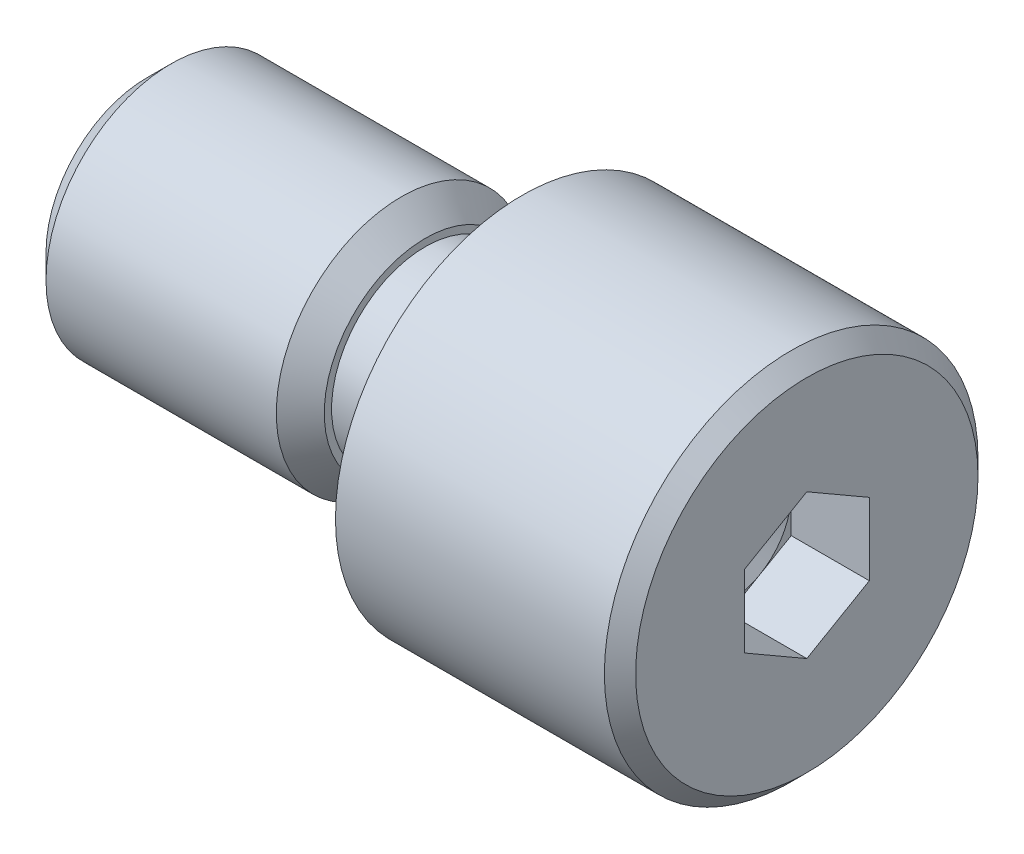
ISO-10303-21;
HEADER;
FILE_DESCRIPTION(('STEP AP214'),'2;1');
FILE_NAME('part.step','',(''),(''),'','','');
FILE_SCHEMA(('AUTOMOTIVE_DESIGN { 1 0 10303 214 1 1 1 1 }'));
ENDSEC;
DATA;
#1=APPLICATION_CONTEXT('core data for automotive mechanical design processes');
#2=APPLICATION_PROTOCOL_DEFINITION('international standard','automotive_design',2000,#1);
#3=PRODUCT_CONTEXT('',#1,'mechanical');
#4=PRODUCT('Part','Part','',(#3));
#5=PRODUCT_RELATED_PRODUCT_CATEGORY('part','',(#4));
#6=PRODUCT_DEFINITION_FORMATION('','',#4);
#7=PRODUCT_DEFINITION_CONTEXT('part definition',#1,'design');
#8=PRODUCT_DEFINITION('design','',#6,#7);
#9=PRODUCT_DEFINITION_SHAPE('','',#8);
#10=(LENGTH_UNIT() NAMED_UNIT(*) SI_UNIT(.MILLI.,.METRE.));
#11=(NAMED_UNIT(*) PLANE_ANGLE_UNIT() SI_UNIT($,.RADIAN.));
#12=(NAMED_UNIT(*) SI_UNIT($,.STERADIAN.) SOLID_ANGLE_UNIT());
#13=UNCERTAINTY_MEASURE_WITH_UNIT(LENGTH_MEASURE(1.E-05),#10,'distance_accuracy_value','');
#14=(GEOMETRIC_REPRESENTATION_CONTEXT(3) GLOBAL_UNCERTAINTY_ASSIGNED_CONTEXT((#13)) GLOBAL_UNIT_ASSIGNED_CONTEXT((#10,
#11,#12)) REPRESENTATION_CONTEXT('',''));
#15=CARTESIAN_POINT('',(0.,0.,0.));
#16=DIRECTION('',(0.,0.,1.));
#17=DIRECTION('',(1.,0.,0.));
#18=AXIS2_PLACEMENT_3D('',#15,#16,#17);
#19=CARTESIAN_POINT('',(18.6,0.,0.));
#20=DIRECTION('',(1.,0.,0.));
#21=DIRECTION('',(0.,0.,-1.));
#22=AXIS2_PLACEMENT_3D('',#19,#20,#21);
#23=PLANE('',#22);
#24=DIRECTION('',(0.,-1.,0.));
#25=VECTOR('',#24,1.);
#26=CARTESIAN_POINT('',(18.6,1.1547005383793,2.));
#27=LINE('',#26,#25);
#28=CARTESIAN_POINT('',(18.6,1.1547005383793,2.));
#29=VERTEX_POINT('',#28);
#30=CARTESIAN_POINT('',(18.6000000000002,0.,2.));
#31=VERTEX_POINT('',#30);
#32=EDGE_CURVE('E271',#29,#31,#27,.T.);
#33=ORIENTED_EDGE('',*,*,#32,.T.);
#34=CARTESIAN_POINT('',(18.6000000000002,0.,0.));
#35=DIRECTION('',(-1.,0.,0.));
#36=DIRECTION('',(0.,0.,1.));
#37=AXIS2_PLACEMENT_3D('',#34,#35,#36);
#38=CIRCLE('',#37,1.99999999999989);
#39=CARTESIAN_POINT('',(18.6000000000002,1.7320508075688,0.999999999999912));
#40=VERTEX_POINT('',#39);
#41=EDGE_CURVE('E56',#31,#40,#38,.T.);
#42=ORIENTED_EDGE('',*,*,#41,.T.);
#43=DIRECTION('',(0.,-0.499999999999983,0.866025403784448));
#44=VECTOR('',#43,1.);
#45=CARTESIAN_POINT('',(18.6,2.3094010767585,0.));
#46=LINE('',#45,#44);
#47=EDGE_CURVE('E303',#40,#29,#46,.T.);
#48=ORIENTED_EDGE('',*,*,#47,.T.);
#49=EDGE_LOOP('',(#33,#42,#48));
#50=FACE_BOUND('',#49,.T.);
#51=ADVANCED_FACE('F41',(#50),#23,.T.);
#52=CARTESIAN_POINT('',(18.6,2.3094010767585,0.));
#53=VERTEX_POINT('',#52);
#54=EDGE_CURVE('E299',#53,#40,#46,.T.);
#55=ORIENTED_EDGE('',*,*,#54,.T.);
#56=CARTESIAN_POINT('',(18.6000000000002,1.7320508075688,-0.999999999999912));
#57=VERTEX_POINT('',#56);
#58=EDGE_CURVE('E244',#40,#57,#38,.T.);
#59=ORIENTED_EDGE('',*,*,#58,.T.);
#60=DIRECTION('',(0.,0.499999999999983,0.866025403784448));
#61=VECTOR('',#60,1.);
#62=CARTESIAN_POINT('',(18.6,1.1547005383793,-2.));
#63=LINE('',#62,#61);
#64=EDGE_CURVE('E309',#57,#53,#63,.T.);
#65=ORIENTED_EDGE('',*,*,#64,.T.);
#66=EDGE_LOOP('',(#55,#59,#65));
#67=FACE_BOUND('',#66,.T.);
#68=ADVANCED_FACE('F132',(#67),#23,.T.);
#69=CARTESIAN_POINT('',(18.6,1.1547005383793,-2.));
#70=VERTEX_POINT('',#69);
#71=EDGE_CURVE('E305',#70,#57,#63,.T.);
#72=ORIENTED_EDGE('',*,*,#71,.T.);
#73=CARTESIAN_POINT('',(18.6000000000002,0.,-1.99999999999989));
#74=VERTEX_POINT('',#73);
#75=EDGE_CURVE('E258',#57,#74,#38,.T.);
#76=ORIENTED_EDGE('',*,*,#75,.T.);
#77=DIRECTION('',(0.,1.,0.));
#78=VECTOR('',#77,1.);
#79=CARTESIAN_POINT('',(18.6,-1.1547005383793,-2.));
#80=LINE('',#79,#78);
#81=EDGE_CURVE('E313',#74,#70,#80,.T.);
#82=ORIENTED_EDGE('',*,*,#81,.T.);
#83=EDGE_LOOP('',(#72,#76,#82));
#84=FACE_BOUND('',#83,.T.);
#85=ADVANCED_FACE('F137',(#84),#23,.T.);
#86=CARTESIAN_POINT('',(18.6,-1.1547005383793,-2.));
#87=VERTEX_POINT('',#86);
#88=EDGE_CURVE('E310',#87,#74,#80,.T.);
#89=ORIENTED_EDGE('',*,*,#88,.T.);
#90=CARTESIAN_POINT('',(18.6000000000002,-1.7320508075688,-0.999999999999912));
#91=VERTEX_POINT('',#90);
#92=EDGE_CURVE('E262',#74,#91,#38,.T.);
#93=ORIENTED_EDGE('',*,*,#92,.T.);
#94=DIRECTION('',(0.,0.499999999999983,-0.866025403784448));
#95=VECTOR('',#94,1.);
#96=CARTESIAN_POINT('',(18.6,-2.3094010767585,0.));
#97=LINE('',#96,#95);
#98=EDGE_CURVE('E316',#91,#87,#97,.T.);
#99=ORIENTED_EDGE('',*,*,#98,.T.);
#100=EDGE_LOOP('',(#89,#93,#99));
#101=FACE_BOUND('',#100,.T.);
#102=ADVANCED_FACE('F327',(#101),#23,.T.);
#103=CARTESIAN_POINT('',(18.6,-2.3094010767585,0.));
#104=VERTEX_POINT('',#103);
#105=EDGE_CURVE('E314',#104,#91,#97,.T.);
#106=ORIENTED_EDGE('',*,*,#105,.T.);
#107=CARTESIAN_POINT('',(18.6000000000002,-1.7320508075688,0.999999999999912));
#108=VERTEX_POINT('',#107);
#109=EDGE_CURVE('E233',#91,#108,#38,.T.);
#110=ORIENTED_EDGE('',*,*,#109,.T.);
#111=DIRECTION('',(0.,-0.499999999999983,-0.866025403784448));
#112=VECTOR('',#111,1.);
#113=CARTESIAN_POINT('',(18.6,-1.1547005383793,2.));
#114=LINE('',#113,#112);
#115=EDGE_CURVE('E285',#108,#104,#114,.T.);
#116=ORIENTED_EDGE('',*,*,#115,.T.);
#117=EDGE_LOOP('',(#106,#110,#116));
#118=FACE_BOUND('',#117,.T.);
#119=ADVANCED_FACE('F130',(#118),#23,.T.);
#120=CARTESIAN_POINT('',(0.,0.,0.));
#121=DIRECTION('',(1.,0.,0.));
#122=DIRECTION('',(0.,0.,-1.));
#123=AXIS2_PLACEMENT_3D('',#120,#121,#122);
#124=CYLINDRICAL_SURFACE('',#123,4.);
#125=CARTESIAN_POINT('',(0.766999999999996,0.,0.));
#126=DIRECTION('',(-1.,0.,0.));
#127=DIRECTION('',(0.,0.,1.));
#128=AXIS2_PLACEMENT_3D('',#125,#126,#127);
#129=CIRCLE('',#128,4.);
#130=CARTESIAN_POINT('',(0.766999999999996,0.,4.));
#131=VERTEX_POINT('',#130);
#132=EDGE_CURVE('E243',#131,#131,#129,.F.);
#133=ORIENTED_EDGE('',*,*,#132,.T.);
#134=EDGE_LOOP('',(#133));
#135=FACE_BOUND('',#134,.T.);
#136=CARTESIAN_POINT('',(8.133,0.,0.));
#137=DIRECTION('',(1.,0.,0.));
#138=DIRECTION('',(0.,0.,-1.));
#139=AXIS2_PLACEMENT_3D('',#136,#137,#138);
#140=CIRCLE('',#139,4.);
#141=CARTESIAN_POINT('',(8.133,0.,-4.));
#142=VERTEX_POINT('',#141);
#143=EDGE_CURVE('E240',#142,#142,#140,.F.);
#144=ORIENTED_EDGE('',*,*,#143,.T.);
#145=EDGE_LOOP('',(#144));
#146=FACE_BOUND('',#145,.T.);
#147=ADVANCED_FACE('F186',(#135,#146),#124,.T.);
#148=CARTESIAN_POINT('',(0.,4.,0.));
#149=DIRECTION('',(-1.,0.,0.));
#150=DIRECTION('',(0.,0.,1.));
#151=AXIS2_PLACEMENT_3D('',#148,#149,#150);
#152=PLANE('',#151);
#153=CARTESIAN_POINT('',(0.,0.,0.));
#154=DIRECTION('',(-1.,0.,0.));
#155=DIRECTION('',(0.,0.,1.));
#156=AXIS2_PLACEMENT_3D('',#153,#154,#155);
#157=CIRCLE('',#156,3.233);
#158=CARTESIAN_POINT('',(0.,0.,3.233));
#159=VERTEX_POINT('',#158);
#160=EDGE_CURVE('E219',#159,#159,#157,.T.);
#161=ORIENTED_EDGE('',*,*,#160,.T.);
#162=EDGE_LOOP('',(#161));
#163=FACE_BOUND('',#162,.T.);
#164=ADVANCED_FACE('F182',(#163),#152,.T.);
#165=CARTESIAN_POINT('',(21.1,0.,0.));
#166=DIRECTION('',(1.,0.,0.));
#167=DIRECTION('',(0.,0.,-1.));
#168=AXIS2_PLACEMENT_3D('',#165,#166,#167);
#169=PLANE('',#168);
#170=CARTESIAN_POINT('',(21.1,0.,0.));
#171=DIRECTION('',(1.,0.,0.));
#172=DIRECTION('',(0.,0.,-1.));
#173=AXIS2_PLACEMENT_3D('',#170,#171,#172);
#174=CIRCLE('',#173,5.475);
#175=CARTESIAN_POINT('',(21.1,0.,-5.475));
#176=VERTEX_POINT('',#175);
#177=EDGE_CURVE('E214',#176,#176,#174,.T.);
#178=ORIENTED_EDGE('',*,*,#177,.T.);
#179=EDGE_LOOP('',(#178));
#180=FACE_BOUND('',#179,.T.);
#181=DIRECTION('',(0.,-0.499999999999983,-0.866025403784448));
#182=VECTOR('',#181,1.);
#183=CARTESIAN_POINT('',(21.1,-1.1547005383793,2.));
#184=LINE('',#183,#182);
#185=CARTESIAN_POINT('',(21.1,-1.1547005383793,2.));
#186=VERTEX_POINT('',#185);
#187=CARTESIAN_POINT('',(21.1,-2.3094010767585,0.));
#188=VERTEX_POINT('',#187);
#189=EDGE_CURVE('E64',#186,#188,#184,.T.);
#190=ORIENTED_EDGE('',*,*,#189,.F.);
#191=DIRECTION('',(0.,-1.,0.));
#192=VECTOR('',#191,1.);
#193=CARTESIAN_POINT('',(21.1,1.1547005383793,2.));
#194=LINE('',#193,#192);
#195=CARTESIAN_POINT('',(21.1,1.1547005383793,2.));
#196=VERTEX_POINT('',#195);
#197=EDGE_CURVE('E282',#196,#186,#194,.T.);
#198=ORIENTED_EDGE('',*,*,#197,.F.);
#199=DIRECTION('',(0.,-0.499999999999983,0.866025403784448));
#200=VECTOR('',#199,1.);
#201=CARTESIAN_POINT('',(21.1,2.3094010767585,0.));
#202=LINE('',#201,#200);
#203=CARTESIAN_POINT('',(21.1,2.3094010767585,0.));
#204=VERTEX_POINT('',#203);
#205=EDGE_CURVE('E279',#204,#196,#202,.T.);
#206=ORIENTED_EDGE('',*,*,#205,.F.);
#207=DIRECTION('',(0.,0.499999999999983,0.866025403784448));
#208=VECTOR('',#207,1.);
#209=CARTESIAN_POINT('',(21.1,1.1547005383793,-2.));
#210=LINE('',#209,#208);
#211=CARTESIAN_POINT('',(21.1,1.1547005383793,-2.));
#212=VERTEX_POINT('',#211);
#213=EDGE_CURVE('E276',#212,#204,#210,.T.);
#214=ORIENTED_EDGE('',*,*,#213,.F.);
#215=DIRECTION('',(0.,1.,0.));
#216=VECTOR('',#215,1.);
#217=CARTESIAN_POINT('',(21.1,-1.1547005383793,-2.));
#218=LINE('',#217,#216);
#219=CARTESIAN_POINT('',(21.1,-1.1547005383793,-2.));
#220=VERTEX_POINT('',#219);
#221=EDGE_CURVE('E268',#220,#212,#218,.T.);
#222=ORIENTED_EDGE('',*,*,#221,.F.);
#223=DIRECTION('',(0.,0.499999999999983,-0.866025403784448));
#224=VECTOR('',#223,1.);
#225=CARTESIAN_POINT('',(21.1,-2.3094010767585,0.));
#226=LINE('',#225,#224);
#227=EDGE_CURVE('E265',#188,#220,#226,.T.);
#228=ORIENTED_EDGE('',*,*,#227,.F.);
#229=EDGE_LOOP('',(#190,#198,#206,#214,#222,#228));
#230=FACE_BOUND('',#229,.T.);
#231=ADVANCED_FACE('F178',(#180,#230),#169,.T.);
#232=CARTESIAN_POINT('',(0.,0.,0.));
#233=DIRECTION('',(1.,0.,0.));
#234=DIRECTION('',(0.,0.,-1.));
#235=AXIS2_PLACEMENT_3D('',#232,#233,#234);
#236=CYLINDRICAL_SURFACE('',#235,5.975);
#237=CARTESIAN_POINT('',(20.6,0.,0.));
#238=DIRECTION('',(1.,0.,0.));
#239=DIRECTION('',(0.,0.,-1.));
#240=AXIS2_PLACEMENT_3D('',#237,#238,#239);
#241=CIRCLE('',#240,5.975);
#242=CARTESIAN_POINT('',(20.6,0.,-5.975));
#243=VERTEX_POINT('',#242);
#244=EDGE_CURVE('E211',#243,#243,#241,.F.);
#245=ORIENTED_EDGE('',*,*,#244,.T.);
#246=EDGE_LOOP('',(#245));
#247=FACE_BOUND('',#246,.T.);
#248=CARTESIAN_POINT('',(12.,0.,0.));
#249=DIRECTION('',(1.,0.,0.));
#250=DIRECTION('',(0.,0.,-1.));
#251=AXIS2_PLACEMENT_3D('',#248,#249,#250);
#252=CIRCLE('',#251,5.975);
#253=CARTESIAN_POINT('',(12.,0.,-5.975));
#254=VERTEX_POINT('',#253);
#255=EDGE_CURVE('E228',#254,#254,#252,.T.);
#256=ORIENTED_EDGE('',*,*,#255,.T.);
#257=EDGE_LOOP('',(#256));
#258=FACE_BOUND('',#257,.T.);
#259=ADVANCED_FACE('F174',(#247,#258),#236,.T.);
#260=CARTESIAN_POINT('',(12.,5.975,0.));
#261=DIRECTION('',(-1.,0.,0.));
#262=DIRECTION('',(0.,0.,1.));
#263=AXIS2_PLACEMENT_3D('',#260,#261,#262);
#264=PLANE('',#263);
#265=CARTESIAN_POINT('',(12.,0.,0.));
#266=DIRECTION('',(-1.,0.,0.));
#267=DIRECTION('',(0.,0.,1.));
#268=AXIS2_PLACEMENT_3D('',#265,#266,#267);
#269=CIRCLE('',#268,3.20000000000054);
#270=CARTESIAN_POINT('',(12.,0.,3.20000000000054));
#271=VERTEX_POINT('',#270);
#272=EDGE_CURVE('E49',#271,#271,#269,.F.);
#273=ORIENTED_EDGE('',*,*,#272,.T.);
#274=EDGE_LOOP('',(#273));
#275=FACE_BOUND('',#274,.T.);
#276=ORIENTED_EDGE('',*,*,#255,.F.);
#277=EDGE_LOOP('',(#276));
#278=FACE_BOUND('',#277,.T.);
#279=ADVANCED_FACE('F170',(#275,#278),#264,.T.);
#280=CARTESIAN_POINT('',(0.,0.,0.));
#281=DIRECTION('',(1.,0.,0.));
#282=DIRECTION('',(0.,0.,-1.));
#283=AXIS2_PLACEMENT_3D('',#280,#281,#282);
#284=CYLINDRICAL_SURFACE('',#283,3.);
#285=CARTESIAN_POINT('',(11.7999999999995,0.,0.));
#286=DIRECTION('',(-1.,0.,0.));
#287=DIRECTION('',(0.,0.,1.));
#288=AXIS2_PLACEMENT_3D('',#285,#286,#287);
#289=CIRCLE('',#288,3.);
#290=CARTESIAN_POINT('',(11.7999999999995,0.,3.));
#291=VERTEX_POINT('',#290);
#292=EDGE_CURVE('E11',#291,#291,#289,.T.);
#293=ORIENTED_EDGE('',*,*,#292,.T.);
#294=EDGE_LOOP('',(#293));
#295=FACE_BOUND('',#294,.T.);
#296=CARTESIAN_POINT('',(8.9,0.,0.));
#297=DIRECTION('',(1.,0.,0.));
#298=DIRECTION('',(0.,0.,-1.));
#299=AXIS2_PLACEMENT_3D('',#296,#297,#298);
#300=CIRCLE('',#299,3.);
#301=CARTESIAN_POINT('',(8.9,0.,-3.));
#302=VERTEX_POINT('',#301);
#303=EDGE_CURVE('E231',#302,#302,#300,.T.);
#304=ORIENTED_EDGE('',*,*,#303,.T.);
#305=EDGE_LOOP('',(#304));
#306=FACE_BOUND('',#305,.T.);
#307=ADVANCED_FACE('F166',(#295,#306),#284,.T.);
#308=CARTESIAN_POINT('',(8.9,3.,0.));
#309=DIRECTION('',(1.,0.,0.));
#310=DIRECTION('',(0.,0.,-1.));
#311=AXIS2_PLACEMENT_3D('',#308,#309,#310);
#312=PLANE('',#311);
#313=CARTESIAN_POINT('',(8.9,0.,0.));
#314=DIRECTION('',(1.,0.,0.));
#315=DIRECTION('',(0.,0.,-1.));
#316=AXIS2_PLACEMENT_3D('',#313,#314,#315);
#317=CIRCLE('',#316,3.23300000000001);
#318=CARTESIAN_POINT('',(8.9,0.,-3.23300000000001));
#319=VERTEX_POINT('',#318);
#320=EDGE_CURVE('E215',#319,#319,#317,.T.);
#321=ORIENTED_EDGE('',*,*,#320,.T.);
#322=EDGE_LOOP('',(#321));
#323=FACE_BOUND('',#322,.T.);
#324=ORIENTED_EDGE('',*,*,#303,.F.);
#325=EDGE_LOOP('',(#324));
#326=FACE_BOUND('',#325,.T.);
#327=ADVANCED_FACE('F163',(#323,#326),#312,.T.);
#328=CARTESIAN_POINT('',(18.6,-1.1547005383793,2.));
#329=DIRECTION('',(0.,-0.866025403784448,0.499999999999983));
#330=DIRECTION('',(0.,-0.499999999999983,-0.866025403784448));
#331=AXIS2_PLACEMENT_3D('',#328,#329,#330);
#332=PLANE('',#331);
#333=ORIENTED_EDGE('',*,*,#189,.T.);
#334=DIRECTION('',(1.,0.,0.));
#335=VECTOR('',#334,1.);
#336=CARTESIAN_POINT('',(18.6,-2.3094010767585,0.));
#337=LINE('',#336,#335);
#338=EDGE_CURVE('E294',#104,#188,#337,.T.);
#339=ORIENTED_EDGE('',*,*,#338,.F.);
#340=ORIENTED_EDGE('',*,*,#115,.F.);
#341=CARTESIAN_POINT('',(18.6,-1.1547005383793,2.));
#342=VERTEX_POINT('',#341);
#343=EDGE_CURVE('E317',#342,#108,#114,.T.);
#344=ORIENTED_EDGE('',*,*,#343,.F.);
#345=DIRECTION('',(1.,0.,0.));
#346=VECTOR('',#345,1.);
#347=CARTESIAN_POINT('',(18.6,-1.1547005383793,2.));
#348=LINE('',#347,#346);
#349=EDGE_CURVE('E236',#342,#186,#348,.T.);
#350=ORIENTED_EDGE('',*,*,#349,.T.);
#351=EDGE_LOOP('',(#333,#339,#340,#344,#350));
#352=FACE_BOUND('',#351,.T.);
#353=ADVANCED_FACE('F145',(#352),#332,.F.);
#354=CARTESIAN_POINT('',(18.6,1.1547005383793,2.));
#355=DIRECTION('',(0.,0.,1.));
#356=DIRECTION('',(0.,-1.,0.));
#357=AXIS2_PLACEMENT_3D('',#354,#355,#356);
#358=PLANE('',#357);
#359=ORIENTED_EDGE('',*,*,#197,.T.);
#360=ORIENTED_EDGE('',*,*,#349,.F.);
#361=EDGE_CURVE('E297',#31,#342,#27,.T.);
#362=ORIENTED_EDGE('',*,*,#361,.F.);
#363=ORIENTED_EDGE('',*,*,#32,.F.);
#364=DIRECTION('',(1.,0.,0.));
#365=VECTOR('',#364,1.);
#366=CARTESIAN_POINT('',(18.6,1.1547005383793,2.));
#367=LINE('',#366,#365);
#368=EDGE_CURVE('E287',#29,#196,#367,.T.);
#369=ORIENTED_EDGE('',*,*,#368,.T.);
#370=EDGE_LOOP('',(#359,#360,#362,#363,#369));
#371=FACE_BOUND('',#370,.T.);
#372=ADVANCED_FACE('F141',(#371),#358,.F.);
#373=CARTESIAN_POINT('',(18.6,2.3094010767585,0.));
#374=DIRECTION('',(0.,0.866025403784448,0.499999999999983));
#375=DIRECTION('',(0.,-0.499999999999983,0.866025403784448));
#376=AXIS2_PLACEMENT_3D('',#373,#374,#375);
#377=PLANE('',#376);
#378=ORIENTED_EDGE('',*,*,#205,.T.);
#379=ORIENTED_EDGE('',*,*,#368,.F.);
#380=ORIENTED_EDGE('',*,*,#47,.F.);
#381=ORIENTED_EDGE('',*,*,#54,.F.);
#382=DIRECTION('',(1.,0.,0.));
#383=VECTOR('',#382,1.);
#384=CARTESIAN_POINT('',(18.6,2.3094010767585,0.));
#385=LINE('',#384,#383);
#386=EDGE_CURVE('E289',#53,#204,#385,.T.);
#387=ORIENTED_EDGE('',*,*,#386,.T.);
#388=EDGE_LOOP('',(#378,#379,#380,#381,#387));
#389=FACE_BOUND('',#388,.T.);
#390=ADVANCED_FACE('F144',(#389),#377,.F.);
#391=CARTESIAN_POINT('',(18.6,1.1547005383793,-2.));
#392=DIRECTION('',(0.,0.866025403784448,-0.499999999999983));
#393=DIRECTION('',(0.,0.499999999999983,0.866025403784448));
#394=AXIS2_PLACEMENT_3D('',#391,#392,#393);
#395=PLANE('',#394);
#396=ORIENTED_EDGE('',*,*,#213,.T.);
#397=ORIENTED_EDGE('',*,*,#386,.F.);
#398=ORIENTED_EDGE('',*,*,#64,.F.);
#399=ORIENTED_EDGE('',*,*,#71,.F.);
#400=DIRECTION('',(1.,0.,0.));
#401=VECTOR('',#400,1.);
#402=CARTESIAN_POINT('',(18.6,1.1547005383793,-2.));
#403=LINE('',#402,#401);
#404=EDGE_CURVE('E291',#70,#212,#403,.T.);
#405=ORIENTED_EDGE('',*,*,#404,.T.);
#406=EDGE_LOOP('',(#396,#397,#398,#399,#405));
#407=FACE_BOUND('',#406,.T.);
#408=ADVANCED_FACE('F149',(#407),#395,.F.);
#409=CARTESIAN_POINT('',(18.6,-1.1547005383793,-2.));
#410=DIRECTION('',(0.,0.,-1.));
#411=DIRECTION('',(0.,1.,0.));
#412=AXIS2_PLACEMENT_3D('',#409,#410,#411);
#413=PLANE('',#412);
#414=ORIENTED_EDGE('',*,*,#221,.T.);
#415=ORIENTED_EDGE('',*,*,#404,.F.);
#416=ORIENTED_EDGE('',*,*,#81,.F.);
#417=ORIENTED_EDGE('',*,*,#88,.F.);
#418=DIRECTION('',(1.,0.,0.));
#419=VECTOR('',#418,1.);
#420=CARTESIAN_POINT('',(18.6,-1.1547005383793,-2.));
#421=LINE('',#420,#419);
#422=EDGE_CURVE('E293',#87,#220,#421,.T.);
#423=ORIENTED_EDGE('',*,*,#422,.T.);
#424=EDGE_LOOP('',(#414,#415,#416,#417,#423));
#425=FACE_BOUND('',#424,.T.);
#426=ADVANCED_FACE('F153',(#425),#413,.F.);
#427=CARTESIAN_POINT('',(18.6,-2.3094010767585,0.));
#428=DIRECTION('',(0.,-0.866025403784448,-0.499999999999983));
#429=DIRECTION('',(0.,0.499999999999983,-0.866025403784448));
#430=AXIS2_PLACEMENT_3D('',#427,#428,#429);
#431=PLANE('',#430);
#432=ORIENTED_EDGE('',*,*,#227,.T.);
#433=ORIENTED_EDGE('',*,*,#422,.F.);
#434=ORIENTED_EDGE('',*,*,#98,.F.);
#435=ORIENTED_EDGE('',*,*,#105,.F.);
#436=ORIENTED_EDGE('',*,*,#338,.T.);
#437=EDGE_LOOP('',(#432,#433,#434,#435,#436));
#438=FACE_BOUND('',#437,.T.);
#439=ADVANCED_FACE('F127',(#438),#431,.F.);
#440=ORIENTED_EDGE('',*,*,#343,.T.);
#441=EDGE_CURVE('E230',#108,#31,#38,.T.);
#442=ORIENTED_EDGE('',*,*,#441,.T.);
#443=ORIENTED_EDGE('',*,*,#361,.T.);
#444=EDGE_LOOP('',(#440,#442,#443));
#445=FACE_BOUND('',#444,.T.);
#446=ADVANCED_FACE('F117',(#445),#23,.T.);
#447=CARTESIAN_POINT('',(17.445299461621,0.,0.));
#448=DIRECTION('',(1.,0.,0.));
#449=DIRECTION('',(0.,0.,-1.));
#450=AXIS2_PLACEMENT_3D('',#447,#448,#449);
#451=CONICAL_SURFACE('',#450,0.,1.0471975511966);
#452=ORIENTED_EDGE('',*,*,#41,.F.);
#453=ORIENTED_EDGE('',*,*,#441,.F.);
#454=ORIENTED_EDGE('',*,*,#109,.F.);
#455=ORIENTED_EDGE('',*,*,#92,.F.);
#456=ORIENTED_EDGE('',*,*,#75,.F.);
#457=ORIENTED_EDGE('',*,*,#58,.F.);
#458=EDGE_LOOP('',(#452,#453,#454,#455,#456,#457));
#459=FACE_BOUND('',#458,.T.);
#460=CARTESIAN_POINT('',(17.445299461621,0.,0.));
#461=VERTEX_POINT('',#460);
#462=VERTEX_LOOP('',#461);
#463=FACE_BOUND('',#462,.T.);
#464=ADVANCED_FACE('F114',(#459,#463),#451,.F.);
#465=CARTESIAN_POINT('',(0.766999999999996,0.,0.));
#466=DIRECTION('',(1.,0.,0.));
#467=DIRECTION('',(0.,0.,-1.));
#468=AXIS2_PLACEMENT_3D('',#465,#466,#467);
#469=CONICAL_SURFACE('',#468,4.,0.785398163397451);
#470=ORIENTED_EDGE('',*,*,#160,.F.);
#471=EDGE_LOOP('',(#470));
#472=FACE_BOUND('',#471,.T.);
#473=ORIENTED_EDGE('',*,*,#132,.F.);
#474=EDGE_LOOP('',(#473));
#475=FACE_BOUND('',#474,.T.);
#476=ADVANCED_FACE('F116',(#472,#475),#469,.T.);
#477=CARTESIAN_POINT('',(8.9,0.,0.));
#478=DIRECTION('',(-1.,0.,0.));
#479=DIRECTION('',(0.,0.,1.));
#480=AXIS2_PLACEMENT_3D('',#477,#478,#479);
#481=CONICAL_SURFACE('',#480,3.23300000000001,0.785398163397446);
#482=ORIENTED_EDGE('',*,*,#143,.F.);
#483=EDGE_LOOP('',(#482));
#484=FACE_BOUND('',#483,.T.);
#485=ORIENTED_EDGE('',*,*,#320,.F.);
#486=EDGE_LOOP('',(#485));
#487=FACE_BOUND('',#486,.T.);
#488=ADVANCED_FACE('F124',(#484,#487),#481,.T.);
#489=CARTESIAN_POINT('',(21.1,0.,0.));
#490=DIRECTION('',(-1.,0.,0.));
#491=DIRECTION('',(0.,0.,1.));
#492=AXIS2_PLACEMENT_3D('',#489,#490,#491);
#493=CONICAL_SURFACE('',#492,5.475,0.785398163397445);
#494=ORIENTED_EDGE('',*,*,#244,.F.);
#495=EDGE_LOOP('',(#494));
#496=FACE_BOUND('',#495,.T.);
#497=ORIENTED_EDGE('',*,*,#177,.F.);
#498=EDGE_LOOP('',(#497));
#499=FACE_BOUND('',#498,.T.);
#500=ADVANCED_FACE('F198',(#496,#499),#493,.T.);
#501=CARTESIAN_POINT('',(11.7999999999995,0.,0.));
#502=DIRECTION('',(-1.,0.,0.));
#503=DIRECTION('',(0.,0.,1.));
#504=AXIS2_PLACEMENT_3D('',#501,#502,#503);
#505=TOROIDAL_SURFACE('',#504,3.20000000000054,0.200000000000544);
#506=ORIENTED_EDGE('',*,*,#292,.F.);
#507=EDGE_LOOP('',(#506));
#508=FACE_BOUND('',#507,.T.);
#509=ORIENTED_EDGE('',*,*,#272,.F.);
#510=EDGE_LOOP('',(#509));
#511=FACE_BOUND('',#510,.T.);
#512=ADVANCED_FACE('F43',(#508,#511),#505,.F.);
#513=CLOSED_SHELL('',(#51,#68,#85,#102,#119,#147,#164,#231,#259,#279,#307,#327,#353,#372,#390,
#408,#426,#439,#446,#464,#476,#488,#500,#512));
#514=MANIFOLD_SOLID_BREP('B2',#513);
#515=ADVANCED_BREP_SHAPE_REPRESENTATION('',(#18,#514),#14);
#516=SHAPE_DEFINITION_REPRESENTATION(#9,#515);
ENDSEC;
END-ISO-10303-21;
